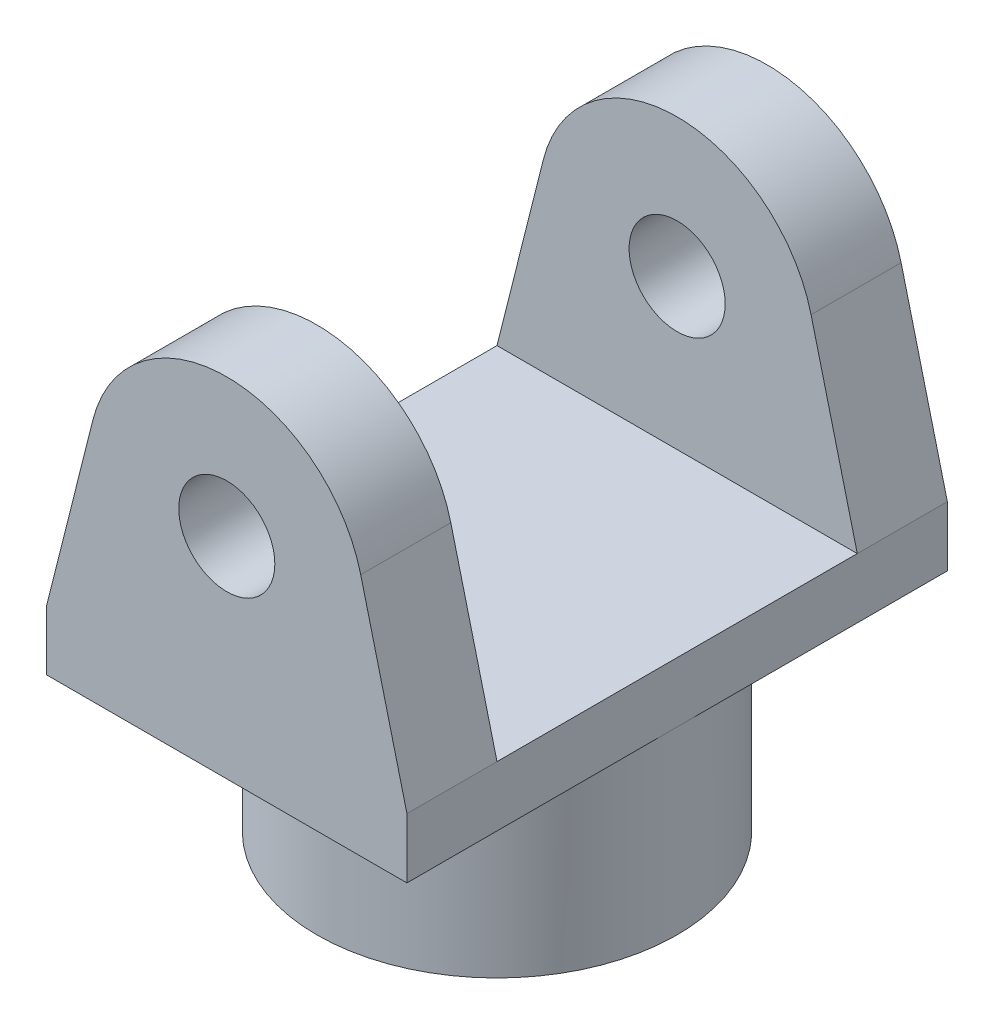
ISO-10303-21;
HEADER;
FILE_DESCRIPTION(('STEP AP214'),'2;1');
FILE_NAME('part.step','',(''),(''),'','','');
FILE_SCHEMA(('AUTOMOTIVE_DESIGN { 1 0 10303 214 1 1 1 1 }'));
ENDSEC;
DATA;
#1=APPLICATION_CONTEXT('core data for automotive mechanical design processes');
#2=APPLICATION_PROTOCOL_DEFINITION('international standard','automotive_design',2000,#1);
#3=PRODUCT_CONTEXT('',#1,'mechanical');
#4=PRODUCT('Part','Part','',(#3));
#5=PRODUCT_RELATED_PRODUCT_CATEGORY('part','',(#4));
#6=PRODUCT_DEFINITION_FORMATION('','',#4);
#7=PRODUCT_DEFINITION_CONTEXT('part definition',#1,'design');
#8=PRODUCT_DEFINITION('design','',#6,#7);
#9=PRODUCT_DEFINITION_SHAPE('','',#8);
#10=(LENGTH_UNIT() NAMED_UNIT(*) SI_UNIT(.MILLI.,.METRE.));
#11=(NAMED_UNIT(*) PLANE_ANGLE_UNIT() SI_UNIT($,.RADIAN.));
#12=(NAMED_UNIT(*) SI_UNIT($,.STERADIAN.) SOLID_ANGLE_UNIT());
#13=UNCERTAINTY_MEASURE_WITH_UNIT(LENGTH_MEASURE(1.E-05),#10,'distance_accuracy_value','');
#14=(GEOMETRIC_REPRESENTATION_CONTEXT(3) GLOBAL_UNCERTAINTY_ASSIGNED_CONTEXT((#13)) GLOBAL_UNIT_ASSIGNED_CONTEXT((#10,
#11,#12)) REPRESENTATION_CONTEXT('',''));
#15=CARTESIAN_POINT('',(0.,0.,0.));
#16=DIRECTION('',(0.,0.,1.));
#17=DIRECTION('',(1.,0.,0.));
#18=AXIS2_PLACEMENT_3D('',#15,#16,#17);
#19=CARTESIAN_POINT('',(0.,10.,0.));
#20=DIRECTION('',(0.,1.,0.));
#21=DIRECTION('',(0.,0.,1.));
#22=AXIS2_PLACEMENT_3D('',#19,#20,#21);
#23=PLANE('',#22);
#24=DIRECTION('',(0.,0.,-1.));
#25=VECTOR('',#24,1.);
#26=CARTESIAN_POINT('',(30.,10.,0.));
#27=LINE('',#26,#25);
#28=CARTESIAN_POINT('',(30.,10.,30.));
#29=VERTEX_POINT('',#28);
#30=CARTESIAN_POINT('',(30.,10.,-30.));
#31=VERTEX_POINT('',#30);
#32=EDGE_CURVE('E261',#29,#31,#27,.T.);
#33=ORIENTED_EDGE('',*,*,#32,.T.);
#34=DIRECTION('',(-1.,0.,0.));
#35=VECTOR('',#34,1.);
#36=CARTESIAN_POINT('',(0.,10.,-30.));
#37=LINE('',#36,#35);
#38=CARTESIAN_POINT('',(-30.,10.,-30.));
#39=VERTEX_POINT('',#38);
#40=EDGE_CURVE('E54',#31,#39,#37,.T.);
#41=ORIENTED_EDGE('',*,*,#40,.T.);
#42=DIRECTION('',(0.,0.,-1.));
#43=VECTOR('',#42,1.);
#44=CARTESIAN_POINT('',(-30.,10.,0.));
#45=LINE('',#44,#43);
#46=CARTESIAN_POINT('',(-30.,10.,30.));
#47=VERTEX_POINT('',#46);
#48=EDGE_CURVE('E260',#47,#39,#45,.T.);
#49=ORIENTED_EDGE('',*,*,#48,.F.);
#50=DIRECTION('',(-1.,0.,0.));
#51=VECTOR('',#50,1.);
#52=CARTESIAN_POINT('',(0.,10.,30.));
#53=LINE('',#52,#51);
#54=EDGE_CURVE('E202',#29,#47,#53,.T.);
#55=ORIENTED_EDGE('',*,*,#54,.F.);
#56=EDGE_LOOP('',(#33,#41,#49,#55));
#57=FACE_BOUND('',#56,.T.);
#58=ADVANCED_FACE('F37',(#57),#23,.T.);
#59=CARTESIAN_POINT('',(0.,0.,0.));
#60=DIRECTION('',(0.,1.,0.));
#61=DIRECTION('',(0.,0.,1.));
#62=AXIS2_PLACEMENT_3D('',#59,#60,#61);
#63=PLANE('',#62);
#64=DIRECTION('',(0.,0.,-1.));
#65=VECTOR('',#64,1.);
#66=CARTESIAN_POINT('',(30.,0.,0.));
#67=LINE('',#66,#65);
#68=CARTESIAN_POINT('',(30.,0.,0.));
#69=VERTEX_POINT('',#68);
#70=CARTESIAN_POINT('',(30.,0.,-45.));
#71=VERTEX_POINT('',#70);
#72=EDGE_CURVE('E248',#69,#71,#67,.T.);
#73=ORIENTED_EDGE('',*,*,#72,.F.);
#74=CARTESIAN_POINT('',(0.,0.,0.));
#75=DIRECTION('',(0.,1.,0.));
#76=DIRECTION('',(0.,0.,1.));
#77=AXIS2_PLACEMENT_3D('',#74,#75,#76);
#78=CIRCLE('',#77,30.);
#79=CARTESIAN_POINT('',(-30.,0.,0.));
#80=VERTEX_POINT('',#79);
#81=EDGE_CURVE('E47',#69,#80,#78,.T.);
#82=ORIENTED_EDGE('',*,*,#81,.T.);
#83=DIRECTION('',(0.,0.,-1.));
#84=VECTOR('',#83,1.);
#85=CARTESIAN_POINT('',(-30.,0.,0.));
#86=LINE('',#85,#84);
#87=CARTESIAN_POINT('',(-30.,0.,-45.));
#88=VERTEX_POINT('',#87);
#89=EDGE_CURVE('E271',#80,#88,#86,.T.);
#90=ORIENTED_EDGE('',*,*,#89,.T.);
#91=DIRECTION('',(-1.,0.,0.));
#92=VECTOR('',#91,1.);
#93=CARTESIAN_POINT('',(0.,0.,-45.));
#94=LINE('',#93,#92);
#95=EDGE_CURVE('E268',#71,#88,#94,.T.);
#96=ORIENTED_EDGE('',*,*,#95,.F.);
#97=EDGE_LOOP('',(#73,#82,#90,#96));
#98=FACE_BOUND('',#97,.T.);
#99=ADVANCED_FACE('F308',(#98),#63,.F.);
#100=CARTESIAN_POINT('',(30.,10.,0.));
#101=DIRECTION('',(-1.,0.,0.));
#102=DIRECTION('',(0.,0.,1.));
#103=AXIS2_PLACEMENT_3D('',#100,#101,#102);
#104=PLANE('',#103);
#105=CARTESIAN_POINT('',(30.,0.,45.));
#106=VERTEX_POINT('',#105);
#107=EDGE_CURVE('E265',#106,#69,#67,.T.);
#108=ORIENTED_EDGE('',*,*,#107,.T.);
#109=ORIENTED_EDGE('',*,*,#72,.T.);
#110=DIRECTION('',(0.,-1.,0.));
#111=VECTOR('',#110,1.);
#112=CARTESIAN_POINT('',(30.,10.,-45.));
#113=LINE('',#112,#111);
#114=CARTESIAN_POINT('',(30.,10.,-45.));
#115=VERTEX_POINT('',#114);
#116=EDGE_CURVE('E41',#115,#71,#113,.T.);
#117=ORIENTED_EDGE('',*,*,#116,.F.);
#118=DIRECTION('',(0.,0.,-1.));
#119=VECTOR('',#118,1.);
#120=CARTESIAN_POINT('',(30.,10.,-30.));
#121=LINE('',#120,#119);
#122=EDGE_CURVE('E62',#31,#115,#121,.T.);
#123=ORIENTED_EDGE('',*,*,#122,.F.);
#124=ORIENTED_EDGE('',*,*,#32,.F.);
#125=CARTESIAN_POINT('',(30.,10.,45.));
#126=VERTEX_POINT('',#125);
#127=EDGE_CURVE('E257',#126,#29,#27,.T.);
#128=ORIENTED_EDGE('',*,*,#127,.F.);
#129=DIRECTION('',(0.,-1.,0.));
#130=VECTOR('',#129,1.);
#131=CARTESIAN_POINT('',(30.,10.,45.));
#132=LINE('',#131,#130);
#133=EDGE_CURVE('E264',#126,#106,#132,.T.);
#134=ORIENTED_EDGE('',*,*,#133,.T.);
#135=EDGE_LOOP('',(#108,#109,#117,#123,#124,#128,#134));
#136=FACE_BOUND('',#135,.T.);
#137=ADVANCED_FACE('F39',(#136),#104,.F.);
#138=CARTESIAN_POINT('',(0.,10.,-45.));
#139=DIRECTION('',(0.,0.,1.));
#140=DIRECTION('',(1.,0.,0.));
#141=AXIS2_PLACEMENT_3D('',#138,#139,#140);
#142=PLANE('',#141);
#143=ORIENTED_EDGE('',*,*,#95,.T.);
#144=DIRECTION('',(0.,-1.,0.));
#145=VECTOR('',#144,1.);
#146=CARTESIAN_POINT('',(-30.,10.,-45.));
#147=LINE('',#146,#145);
#148=CARTESIAN_POINT('',(-30.,10.,-45.));
#149=VERTEX_POINT('',#148);
#150=EDGE_CURVE('E280',#149,#88,#147,.T.);
#151=ORIENTED_EDGE('',*,*,#150,.F.);
#152=DIRECTION('',(0.243792806743324,0.969827338952771,0.));
#153=VECTOR('',#152,1.);
#154=CARTESIAN_POINT('',(-30.5813213116034,7.68745719678904,-45.));
#155=LINE('',#154,#153);
#156=CARTESIAN_POINT('',(-22.3060287959137,40.6072345550965,-45.));
#157=VERTEX_POINT('',#156);
#158=EDGE_CURVE('E182',#149,#157,#155,.T.);
#159=ORIENTED_EDGE('',*,*,#158,.T.);
#160=CARTESIAN_POINT('',(0.,35.,-45.));
#161=DIRECTION('',(0.,0.,1.));
#162=DIRECTION('',(1.,0.,0.));
#163=AXIS2_PLACEMENT_3D('',#160,#161,#162);
#164=CIRCLE('',#163,23.);
#165=CARTESIAN_POINT('',(22.3060287959137,40.6072345550965,-45.));
#166=VERTEX_POINT('',#165);
#167=EDGE_CURVE('E162',#166,#157,#164,.T.);
#168=ORIENTED_EDGE('',*,*,#167,.F.);
#169=DIRECTION('',(-0.243792806743324,0.969827338952771,0.));
#170=VECTOR('',#169,1.);
#171=CARTESIAN_POINT('',(30.5813213116034,7.68745719678904,-45.));
#172=LINE('',#171,#170);
#173=EDGE_CURVE('E179',#115,#166,#172,.T.);
#174=ORIENTED_EDGE('',*,*,#173,.F.);
#175=ORIENTED_EDGE('',*,*,#116,.T.);
#176=EDGE_LOOP('',(#143,#151,#159,#168,#174,#175));
#177=FACE_BOUND('',#176,.T.);
#178=CARTESIAN_POINT('',(0.,35.,-45.));
#179=DIRECTION('',(0.,0.,1.));
#180=DIRECTION('',(1.,0.,0.));
#181=AXIS2_PLACEMENT_3D('',#178,#179,#180);
#182=CIRCLE('',#181,8.);
#183=CARTESIAN_POINT('',(7.99999999999999,35.,-45.));
#184=VERTEX_POINT('',#183);
#185=EDGE_CURVE('E176',#184,#184,#182,.T.);
#186=ORIENTED_EDGE('',*,*,#185,.T.);
#187=EDGE_LOOP('',(#186));
#188=FACE_BOUND('',#187,.T.);
#189=ADVANCED_FACE('F287',(#177,#188),#142,.F.);
#190=CARTESIAN_POINT('',(-30.,10.,0.));
#191=DIRECTION('',(-1.,0.,0.));
#192=DIRECTION('',(0.,0.,1.));
#193=AXIS2_PLACEMENT_3D('',#190,#191,#192);
#194=PLANE('',#193);
#195=CARTESIAN_POINT('',(-30.,0.,45.));
#196=VERTEX_POINT('',#195);
#197=EDGE_CURVE('E272',#196,#80,#86,.T.);
#198=ORIENTED_EDGE('',*,*,#197,.F.);
#199=DIRECTION('',(0.,-1.,0.));
#200=VECTOR('',#199,1.);
#201=CARTESIAN_POINT('',(-30.,10.,45.));
#202=LINE('',#201,#200);
#203=CARTESIAN_POINT('',(-30.,10.,45.));
#204=VERTEX_POINT('',#203);
#205=EDGE_CURVE('E279',#204,#196,#202,.T.);
#206=ORIENTED_EDGE('',*,*,#205,.F.);
#207=EDGE_CURVE('E262',#204,#47,#45,.T.);
#208=ORIENTED_EDGE('',*,*,#207,.T.);
#209=ORIENTED_EDGE('',*,*,#48,.T.);
#210=DIRECTION('',(0.,0.,-1.));
#211=VECTOR('',#210,1.);
#212=CARTESIAN_POINT('',(-30.,10.,-30.));
#213=LINE('',#212,#211);
#214=EDGE_CURVE('E167',#39,#149,#213,.T.);
#215=ORIENTED_EDGE('',*,*,#214,.T.);
#216=ORIENTED_EDGE('',*,*,#150,.T.);
#217=ORIENTED_EDGE('',*,*,#89,.F.);
#218=EDGE_LOOP('',(#198,#206,#208,#209,#215,#216,#217));
#219=FACE_BOUND('',#218,.T.);
#220=ADVANCED_FACE('F326',(#219),#194,.T.);
#221=CARTESIAN_POINT('',(0.,10.,45.));
#222=DIRECTION('',(0.,0.,1.));
#223=DIRECTION('',(1.,0.,0.));
#224=AXIS2_PLACEMENT_3D('',#221,#222,#223);
#225=PLANE('',#224);
#226=DIRECTION('',(-1.,0.,0.));
#227=VECTOR('',#226,1.);
#228=CARTESIAN_POINT('',(0.,0.,45.));
#229=LINE('',#228,#227);
#230=EDGE_CURVE('E275',#106,#196,#229,.T.);
#231=ORIENTED_EDGE('',*,*,#230,.F.);
#232=ORIENTED_EDGE('',*,*,#133,.F.);
#233=DIRECTION('',(-0.243792806743324,0.969827338952771,0.));
#234=VECTOR('',#233,1.);
#235=CARTESIAN_POINT('',(30.5813213116034,7.68745719678904,45.));
#236=LINE('',#235,#234);
#237=CARTESIAN_POINT('',(22.3060287959137,40.6072345550965,45.));
#238=VERTEX_POINT('',#237);
#239=EDGE_CURVE('E208',#126,#238,#236,.T.);
#240=ORIENTED_EDGE('',*,*,#239,.T.);
#241=CARTESIAN_POINT('',(0.,35.,45.));
#242=DIRECTION('',(0.,0.,1.));
#243=DIRECTION('',(1.,0.,0.));
#244=AXIS2_PLACEMENT_3D('',#241,#242,#243);
#245=CIRCLE('',#244,23.);
#246=CARTESIAN_POINT('',(-22.3060287959137,40.6072345550965,45.));
#247=VERTEX_POINT('',#246);
#248=EDGE_CURVE('E211',#238,#247,#245,.T.);
#249=ORIENTED_EDGE('',*,*,#248,.T.);
#250=DIRECTION('',(0.243792806743324,0.969827338952771,0.));
#251=VECTOR('',#250,1.);
#252=CARTESIAN_POINT('',(-30.5813213116034,7.68745719678904,45.));
#253=LINE('',#252,#251);
#254=EDGE_CURVE('E194',#204,#247,#253,.T.);
#255=ORIENTED_EDGE('',*,*,#254,.F.);
#256=ORIENTED_EDGE('',*,*,#205,.T.);
#257=EDGE_LOOP('',(#231,#232,#240,#249,#255,#256));
#258=FACE_BOUND('',#257,.T.);
#259=CARTESIAN_POINT('',(0.,35.,45.));
#260=DIRECTION('',(0.,0.,1.));
#261=DIRECTION('',(1.,0.,0.));
#262=AXIS2_PLACEMENT_3D('',#259,#260,#261);
#263=CIRCLE('',#262,8.);
#264=CARTESIAN_POINT('',(7.99999999999999,35.,45.));
#265=VERTEX_POINT('',#264);
#266=EDGE_CURVE('E186',#265,#265,#263,.T.);
#267=ORIENTED_EDGE('',*,*,#266,.F.);
#268=EDGE_LOOP('',(#267));
#269=FACE_BOUND('',#268,.T.);
#270=ADVANCED_FACE('F322',(#258,#269),#225,.T.);
#271=ORIENTED_EDGE('',*,*,#197,.T.);
#272=EDGE_CURVE('E11',#80,#69,#78,.T.);
#273=ORIENTED_EDGE('',*,*,#272,.T.);
#274=ORIENTED_EDGE('',*,*,#107,.F.);
#275=ORIENTED_EDGE('',*,*,#230,.T.);
#276=EDGE_LOOP('',(#271,#273,#274,#275));
#277=FACE_BOUND('',#276,.T.);
#278=ADVANCED_FACE('F315',(#277),#63,.F.);
#279=CARTESIAN_POINT('',(0.,-30.,0.));
#280=DIRECTION('',(0.,1.,0.));
#281=DIRECTION('',(0.,0.,1.));
#282=AXIS2_PLACEMENT_3D('',#279,#280,#281);
#283=CYLINDRICAL_SURFACE('',#282,15.);
#284=CARTESIAN_POINT('',(0.,0.,0.));
#285=DIRECTION('',(0.,1.,0.));
#286=DIRECTION('',(0.,0.,1.));
#287=AXIS2_PLACEMENT_3D('',#284,#285,#286);
#288=CIRCLE('',#287,15.);
#289=CARTESIAN_POINT('',(-5.,0.,-14.142135623731));
#290=VERTEX_POINT('',#289);
#291=CARTESIAN_POINT('',(5.,0.,-14.142135623731));
#292=VERTEX_POINT('',#291);
#293=EDGE_CURVE('E218',#290,#292,#288,.T.);
#294=ORIENTED_EDGE('',*,*,#293,.T.);
#295=DIRECTION('',(0.,1.,0.));
#296=VECTOR('',#295,1.);
#297=CARTESIAN_POINT('',(5.,-30.,-14.142135623731));
#298=LINE('',#297,#296);
#299=CARTESIAN_POINT('',(5.,-30.,-14.142135623731));
#300=VERTEX_POINT('',#299);
#301=EDGE_CURVE('E245',#300,#292,#298,.T.);
#302=ORIENTED_EDGE('',*,*,#301,.F.);
#303=CARTESIAN_POINT('',(0.,-30.,0.));
#304=DIRECTION('',(0.,1.,0.));
#305=DIRECTION('',(0.,0.,1.));
#306=AXIS2_PLACEMENT_3D('',#303,#304,#305);
#307=CIRCLE('',#306,15.);
#308=CARTESIAN_POINT('',(-5.,-30.,-14.142135623731));
#309=VERTEX_POINT('',#308);
#310=EDGE_CURVE('E220',#309,#300,#307,.T.);
#311=ORIENTED_EDGE('',*,*,#310,.F.);
#312=DIRECTION('',(0.,1.,0.));
#313=VECTOR('',#312,1.);
#314=CARTESIAN_POINT('',(-5.,-30.,-14.142135623731));
#315=LINE('',#314,#313);
#316=EDGE_CURVE('E234',#309,#290,#315,.T.);
#317=ORIENTED_EDGE('',*,*,#316,.T.);
#318=EDGE_LOOP('',(#294,#302,#311,#317));
#319=FACE_BOUND('',#318,.T.);
#320=ADVANCED_FACE('F318',(#319),#283,.F.);
#321=CARTESIAN_POINT('',(5.,-30.,0.));
#322=DIRECTION('',(1.,0.,0.));
#323=DIRECTION('',(0.,0.,-1.));
#324=AXIS2_PLACEMENT_3D('',#321,#322,#323);
#325=PLANE('',#324);
#326=DIRECTION('',(0.,0.,-1.));
#327=VECTOR('',#326,1.);
#328=CARTESIAN_POINT('',(5.,0.,0.));
#329=LINE('',#328,#327);
#330=CARTESIAN_POINT('',(5.,0.,-20.142135623731));
#331=VERTEX_POINT('',#330);
#332=EDGE_CURVE('E241',#292,#331,#329,.T.);
#333=ORIENTED_EDGE('',*,*,#332,.T.);
#334=DIRECTION('',(0.,1.,0.));
#335=VECTOR('',#334,1.);
#336=CARTESIAN_POINT('',(5.,-30.,-20.142135623731));
#337=LINE('',#336,#335);
#338=CARTESIAN_POINT('',(5.,-30.,-20.142135623731));
#339=VERTEX_POINT('',#338);
#340=EDGE_CURVE('E249',#339,#331,#337,.T.);
#341=ORIENTED_EDGE('',*,*,#340,.F.);
#342=DIRECTION('',(0.,0.,-1.));
#343=VECTOR('',#342,1.);
#344=CARTESIAN_POINT('',(5.,-30.,0.));
#345=LINE('',#344,#343);
#346=EDGE_CURVE('E229',#300,#339,#345,.T.);
#347=ORIENTED_EDGE('',*,*,#346,.F.);
#348=ORIENTED_EDGE('',*,*,#301,.T.);
#349=EDGE_LOOP('',(#333,#341,#347,#348));
#350=FACE_BOUND('',#349,.T.);
#351=ADVANCED_FACE('F358',(#350),#325,.F.);
#352=CARTESIAN_POINT('',(0.,-30.,-20.142135623731));
#353=DIRECTION('',(0.,0.,1.));
#354=DIRECTION('',(1.,0.,0.));
#355=AXIS2_PLACEMENT_3D('',#352,#353,#354);
#356=PLANE('',#355);
#357=DIRECTION('',(1.,0.,0.));
#358=VECTOR('',#357,1.);
#359=CARTESIAN_POINT('',(0.,0.,-20.142135623731));
#360=LINE('',#359,#358);
#361=CARTESIAN_POINT('',(-5.,0.,-20.142135623731));
#362=VERTEX_POINT('',#361);
#363=EDGE_CURVE('E239',#362,#331,#360,.T.);
#364=ORIENTED_EDGE('',*,*,#363,.F.);
#365=DIRECTION('',(0.,1.,0.));
#366=VECTOR('',#365,1.);
#367=CARTESIAN_POINT('',(-5.,-30.,-20.142135623731));
#368=LINE('',#367,#366);
#369=CARTESIAN_POINT('',(-5.,-30.,-20.142135623731));
#370=VERTEX_POINT('',#369);
#371=EDGE_CURVE('E252',#370,#362,#368,.T.);
#372=ORIENTED_EDGE('',*,*,#371,.F.);
#373=DIRECTION('',(1.,0.,0.));
#374=VECTOR('',#373,1.);
#375=CARTESIAN_POINT('',(0.,-30.,-20.142135623731));
#376=LINE('',#375,#374);
#377=EDGE_CURVE('E226',#370,#339,#376,.T.);
#378=ORIENTED_EDGE('',*,*,#377,.T.);
#379=ORIENTED_EDGE('',*,*,#340,.T.);
#380=EDGE_LOOP('',(#364,#372,#378,#379));
#381=FACE_BOUND('',#380,.T.);
#382=ADVANCED_FACE('F368',(#381),#356,.T.);
#383=CARTESIAN_POINT('',(-5.,-30.,0.));
#384=DIRECTION('',(1.,0.,0.));
#385=DIRECTION('',(0.,0.,-1.));
#386=AXIS2_PLACEMENT_3D('',#383,#384,#385);
#387=PLANE('',#386);
#388=DIRECTION('',(0.,0.,-1.));
#389=VECTOR('',#388,1.);
#390=CARTESIAN_POINT('',(-5.,0.,0.));
#391=LINE('',#390,#389);
#392=EDGE_CURVE('E237',#290,#362,#391,.T.);
#393=ORIENTED_EDGE('',*,*,#392,.F.);
#394=ORIENTED_EDGE('',*,*,#316,.F.);
#395=DIRECTION('',(0.,0.,-1.));
#396=VECTOR('',#395,1.);
#397=CARTESIAN_POINT('',(-5.,-30.,0.));
#398=LINE('',#397,#396);
#399=EDGE_CURVE('E223',#309,#370,#398,.T.);
#400=ORIENTED_EDGE('',*,*,#399,.T.);
#401=ORIENTED_EDGE('',*,*,#371,.T.);
#402=EDGE_LOOP('',(#393,#394,#400,#401));
#403=FACE_BOUND('',#402,.T.);
#404=ADVANCED_FACE('F378',(#403),#387,.T.);
#405=CARTESIAN_POINT('',(0.,-30.,0.));
#406=DIRECTION('',(0.,1.,0.));
#407=DIRECTION('',(0.,0.,1.));
#408=AXIS2_PLACEMENT_3D('',#405,#406,#407);
#409=CYLINDRICAL_SURFACE('',#408,30.);
#410=CARTESIAN_POINT('',(0.,-30.,0.));
#411=DIRECTION('',(0.,1.,0.));
#412=DIRECTION('',(0.,0.,1.));
#413=AXIS2_PLACEMENT_3D('',#410,#411,#412);
#414=CIRCLE('',#413,30.);
#415=CARTESIAN_POINT('',(0.,-30.,30.));
#416=VERTEX_POINT('',#415);
#417=EDGE_CURVE('E231',#416,#416,#414,.T.);
#418=ORIENTED_EDGE('',*,*,#417,.T.);
#419=EDGE_LOOP('',(#418));
#420=FACE_BOUND('',#419,.T.);
#421=ORIENTED_EDGE('',*,*,#81,.F.);
#422=ORIENTED_EDGE('',*,*,#272,.F.);
#423=EDGE_LOOP('',(#421,#422));
#424=FACE_BOUND('',#423,.T.);
#425=ADVANCED_FACE('F388',(#420,#424),#409,.T.);
#426=CARTESIAN_POINT('',(0.,-30.,0.));
#427=DIRECTION('',(0.,1.,0.));
#428=DIRECTION('',(0.,0.,1.));
#429=AXIS2_PLACEMENT_3D('',#426,#427,#428);
#430=PLANE('',#429);
#431=ORIENTED_EDGE('',*,*,#310,.T.);
#432=ORIENTED_EDGE('',*,*,#346,.T.);
#433=ORIENTED_EDGE('',*,*,#377,.F.);
#434=ORIENTED_EDGE('',*,*,#399,.F.);
#435=EDGE_LOOP('',(#431,#432,#433,#434));
#436=FACE_BOUND('',#435,.T.);
#437=ORIENTED_EDGE('',*,*,#417,.F.);
#438=EDGE_LOOP('',(#437));
#439=FACE_BOUND('',#438,.T.);
#440=ADVANCED_FACE('F397',(#436,#439),#430,.F.);
#441=ORIENTED_EDGE('',*,*,#293,.F.);
#442=ORIENTED_EDGE('',*,*,#392,.T.);
#443=ORIENTED_EDGE('',*,*,#363,.T.);
#444=ORIENTED_EDGE('',*,*,#332,.F.);
#445=EDGE_LOOP('',(#441,#442,#443,#444));
#446=FACE_BOUND('',#445,.T.);
#447=ADVANCED_FACE('F316',(#446),#63,.F.);
#448=CARTESIAN_POINT('',(30.5813213116034,7.68745719678904,30.));
#449=DIRECTION('',(0.969827338952771,0.243792806743324,0.));
#450=DIRECTION('',(-0.243792806743324,0.969827338952771,0.));
#451=AXIS2_PLACEMENT_3D('',#448,#449,#450);
#452=PLANE('',#451);
#453=ORIENTED_EDGE('',*,*,#239,.F.);
#454=ORIENTED_EDGE('',*,*,#127,.T.);
#455=DIRECTION('',(-0.243792806743324,0.969827338952771,0.));
#456=VECTOR('',#455,1.);
#457=CARTESIAN_POINT('',(30.5813213116034,7.68745719678904,30.));
#458=LINE('',#457,#456);
#459=CARTESIAN_POINT('',(22.3060287959137,40.6072345550965,30.));
#460=VERTEX_POINT('',#459);
#461=EDGE_CURVE('E193',#29,#460,#458,.T.);
#462=ORIENTED_EDGE('',*,*,#461,.T.);
#463=DIRECTION('',(0.,0.,1.));
#464=VECTOR('',#463,1.);
#465=CARTESIAN_POINT('',(22.3060287959137,40.6072345550965,30.));
#466=LINE('',#465,#464);
#467=EDGE_CURVE('E205',#460,#238,#466,.T.);
#468=ORIENTED_EDGE('',*,*,#467,.T.);
#469=EDGE_LOOP('',(#453,#454,#462,#468));
#470=FACE_BOUND('',#469,.T.);
#471=ADVANCED_FACE('F416',(#470),#452,.T.);
#472=CARTESIAN_POINT('',(-30.5813213116034,7.68745719678904,30.));
#473=DIRECTION('',(0.969827338952771,-0.243792806743324,0.));
#474=DIRECTION('',(0.243792806743324,0.969827338952771,0.));
#475=AXIS2_PLACEMENT_3D('',#472,#473,#474);
#476=PLANE('',#475);
#477=ORIENTED_EDGE('',*,*,#254,.T.);
#478=DIRECTION('',(0.,0.,1.));
#479=VECTOR('',#478,1.);
#480=CARTESIAN_POINT('',(-22.3060287959137,40.6072345550965,30.));
#481=LINE('',#480,#479);
#482=CARTESIAN_POINT('',(-22.3060287959137,40.6072345550965,30.));
#483=VERTEX_POINT('',#482);
#484=EDGE_CURVE('E216',#483,#247,#481,.T.);
#485=ORIENTED_EDGE('',*,*,#484,.F.);
#486=DIRECTION('',(0.243792806743324,0.969827338952771,0.));
#487=VECTOR('',#486,1.);
#488=CARTESIAN_POINT('',(-30.5813213116034,7.68745719678904,30.));
#489=LINE('',#488,#487);
#490=EDGE_CURVE('E200',#47,#483,#489,.T.);
#491=ORIENTED_EDGE('',*,*,#490,.F.);
#492=ORIENTED_EDGE('',*,*,#207,.F.);
#493=EDGE_LOOP('',(#477,#485,#491,#492));
#494=FACE_BOUND('',#493,.T.);
#495=ADVANCED_FACE('F432',(#494),#476,.F.);
#496=CARTESIAN_POINT('',(0.,35.,30.));
#497=DIRECTION('',(0.,0.,1.));
#498=DIRECTION('',(1.,0.,0.));
#499=AXIS2_PLACEMENT_3D('',#496,#497,#498);
#500=CYLINDRICAL_SURFACE('',#499,8.);
#501=CARTESIAN_POINT('',(0.,35.,30.));
#502=DIRECTION('',(0.,0.,1.));
#503=DIRECTION('',(1.,0.,0.));
#504=AXIS2_PLACEMENT_3D('',#501,#502,#503);
#505=CIRCLE('',#504,8.);
#506=CARTESIAN_POINT('',(7.99999999999999,35.,30.));
#507=VERTEX_POINT('',#506);
#508=EDGE_CURVE('E190',#507,#507,#505,.T.);
#509=ORIENTED_EDGE('',*,*,#508,.F.);
#510=EDGE_LOOP('',(#509));
#511=FACE_BOUND('',#510,.T.);
#512=ORIENTED_EDGE('',*,*,#266,.T.);
#513=EDGE_LOOP('',(#512));
#514=FACE_BOUND('',#513,.T.);
#515=ADVANCED_FACE('F442',(#511,#514),#500,.F.);
#516=CARTESIAN_POINT('',(0.,35.,30.));
#517=DIRECTION('',(0.,0.,1.));
#518=DIRECTION('',(1.,0.,0.));
#519=AXIS2_PLACEMENT_3D('',#516,#517,#518);
#520=CYLINDRICAL_SURFACE('',#519,23.);
#521=ORIENTED_EDGE('',*,*,#248,.F.);
#522=ORIENTED_EDGE('',*,*,#467,.F.);
#523=CARTESIAN_POINT('',(0.,35.,30.));
#524=DIRECTION('',(0.,0.,1.));
#525=DIRECTION('',(1.,0.,0.));
#526=AXIS2_PLACEMENT_3D('',#523,#524,#525);
#527=CIRCLE('',#526,23.);
#528=EDGE_CURVE('E197',#460,#483,#527,.T.);
#529=ORIENTED_EDGE('',*,*,#528,.T.);
#530=ORIENTED_EDGE('',*,*,#484,.T.);
#531=EDGE_LOOP('',(#521,#522,#529,#530));
#532=FACE_BOUND('',#531,.T.);
#533=ADVANCED_FACE('F452',(#532),#520,.T.);
#534=CARTESIAN_POINT('',(0.,0.,30.));
#535=DIRECTION('',(0.,0.,1.));
#536=DIRECTION('',(1.,0.,0.));
#537=AXIS2_PLACEMENT_3D('',#534,#535,#536);
#538=PLANE('',#537);
#539=ORIENTED_EDGE('',*,*,#508,.T.);
#540=EDGE_LOOP('',(#539));
#541=FACE_BOUND('',#540,.T.);
#542=ORIENTED_EDGE('',*,*,#461,.F.);
#543=ORIENTED_EDGE('',*,*,#54,.T.);
#544=ORIENTED_EDGE('',*,*,#490,.T.);
#545=ORIENTED_EDGE('',*,*,#528,.F.);
#546=EDGE_LOOP('',(#542,#543,#544,#545));
#547=FACE_BOUND('',#546,.T.);
#548=ADVANCED_FACE('F462',(#541,#547),#538,.F.);
#549=CARTESIAN_POINT('',(30.5813213116034,7.68745719678904,-30.));
#550=DIRECTION('',(-0.969827338952771,-0.243792806743324,0.));
#551=DIRECTION('',(0.243792806743324,-0.969827338952771,0.));
#552=AXIS2_PLACEMENT_3D('',#549,#550,#551);
#553=PLANE('',#552);
#554=ORIENTED_EDGE('',*,*,#173,.T.);
#555=DIRECTION('',(0.,0.,-1.));
#556=VECTOR('',#555,1.);
#557=CARTESIAN_POINT('',(22.3060287959137,40.6072345550965,-30.));
#558=LINE('',#557,#556);
#559=CARTESIAN_POINT('',(22.3060287959137,40.6072345550965,-30.));
#560=VERTEX_POINT('',#559);
#561=EDGE_CURVE('E166',#560,#166,#558,.T.);
#562=ORIENTED_EDGE('',*,*,#561,.F.);
#563=DIRECTION('',(-0.243792806743324,0.969827338952771,0.));
#564=VECTOR('',#563,1.);
#565=CARTESIAN_POINT('',(30.5813213116034,7.68745719678904,-30.));
#566=LINE('',#565,#564);
#567=EDGE_CURVE('E154',#31,#560,#566,.T.);
#568=ORIENTED_EDGE('',*,*,#567,.F.);
#569=ORIENTED_EDGE('',*,*,#122,.T.);
#570=EDGE_LOOP('',(#554,#562,#568,#569));
#571=FACE_BOUND('',#570,.T.);
#572=ADVANCED_FACE('F292',(#571),#553,.F.);
#573=CARTESIAN_POINT('',(0.,35.,-30.));
#574=DIRECTION('',(0.,0.,-1.));
#575=DIRECTION('',(-1.,0.,0.));
#576=AXIS2_PLACEMENT_3D('',#573,#574,#575);
#577=CYLINDRICAL_SURFACE('',#576,23.);
#578=ORIENTED_EDGE('',*,*,#167,.T.);
#579=DIRECTION('',(0.,0.,-1.));
#580=VECTOR('',#579,1.);
#581=CARTESIAN_POINT('',(-22.3060287959137,40.6072345550965,-30.));
#582=LINE('',#581,#580);
#583=CARTESIAN_POINT('',(-22.3060287959137,40.6072345550965,-30.));
#584=VERTEX_POINT('',#583);
#585=EDGE_CURVE('E160',#584,#157,#582,.T.);
#586=ORIENTED_EDGE('',*,*,#585,.F.);
#587=CARTESIAN_POINT('',(0.,35.,-30.));
#588=DIRECTION('',(0.,0.,1.));
#589=DIRECTION('',(1.,0.,0.));
#590=AXIS2_PLACEMENT_3D('',#587,#588,#589);
#591=CIRCLE('',#590,23.);
#592=EDGE_CURVE('E148',#560,#584,#591,.T.);
#593=ORIENTED_EDGE('',*,*,#592,.F.);
#594=ORIENTED_EDGE('',*,*,#561,.T.);
#595=EDGE_LOOP('',(#578,#586,#593,#594));
#596=FACE_BOUND('',#595,.T.);
#597=ADVANCED_FACE('F161',(#596),#577,.T.);
#598=CARTESIAN_POINT('',(-30.5813213116034,7.68745719678904,-30.));
#599=DIRECTION('',(-0.969827338952771,0.243792806743324,0.));
#600=DIRECTION('',(-0.243792806743324,-0.969827338952771,0.));
#601=AXIS2_PLACEMENT_3D('',#598,#599,#600);
#602=PLANE('',#601);
#603=ORIENTED_EDGE('',*,*,#158,.F.);
#604=ORIENTED_EDGE('',*,*,#214,.F.);
#605=DIRECTION('',(0.243792806743324,0.969827338952771,0.));
#606=VECTOR('',#605,1.);
#607=CARTESIAN_POINT('',(-30.5813213116034,7.68745719678904,-30.));
#608=LINE('',#607,#606);
#609=EDGE_CURVE('E152',#39,#584,#608,.T.);
#610=ORIENTED_EDGE('',*,*,#609,.T.);
#611=ORIENTED_EDGE('',*,*,#585,.T.);
#612=EDGE_LOOP('',(#603,#604,#610,#611));
#613=FACE_BOUND('',#612,.T.);
#614=ADVANCED_FACE('F170',(#613),#602,.T.);
#615=CARTESIAN_POINT('',(0.,35.,-30.));
#616=DIRECTION('',(0.,0.,-1.));
#617=DIRECTION('',(-1.,0.,0.));
#618=AXIS2_PLACEMENT_3D('',#615,#616,#617);
#619=CYLINDRICAL_SURFACE('',#618,8.);
#620=CARTESIAN_POINT('',(0.,35.,-30.));
#621=DIRECTION('',(0.,0.,1.));
#622=DIRECTION('',(1.,0.,0.));
#623=AXIS2_PLACEMENT_3D('',#620,#621,#622);
#624=CIRCLE('',#623,8.);
#625=CARTESIAN_POINT('',(7.99999999999999,35.,-30.));
#626=VERTEX_POINT('',#625);
#627=EDGE_CURVE('E185',#626,#626,#624,.T.);
#628=ORIENTED_EDGE('',*,*,#627,.T.);
#629=EDGE_LOOP('',(#628));
#630=FACE_BOUND('',#629,.T.);
#631=ORIENTED_EDGE('',*,*,#185,.F.);
#632=EDGE_LOOP('',(#631));
#633=FACE_BOUND('',#632,.T.);
#634=ADVANCED_FACE('F297',(#630,#633),#619,.F.);
#635=CARTESIAN_POINT('',(0.,0.,-30.));
#636=DIRECTION('',(0.,0.,-1.));
#637=DIRECTION('',(1.,0.,0.));
#638=AXIS2_PLACEMENT_3D('',#635,#636,#637);
#639=PLANE('',#638);
#640=ORIENTED_EDGE('',*,*,#627,.F.);
#641=EDGE_LOOP('',(#640));
#642=FACE_BOUND('',#641,.T.);
#643=ORIENTED_EDGE('',*,*,#567,.T.);
#644=ORIENTED_EDGE('',*,*,#592,.T.);
#645=ORIENTED_EDGE('',*,*,#609,.F.);
#646=ORIENTED_EDGE('',*,*,#40,.F.);
#647=EDGE_LOOP('',(#643,#644,#645,#646));
#648=FACE_BOUND('',#647,.T.);
#649=ADVANCED_FACE('F150',(#642,#648),#639,.F.);
#650=CLOSED_SHELL('',(#58,#99,#137,#189,#220,#270,#278,#320,#351,#382,#404,#425,#440,#447,#471,
#495,#515,#533,#548,#572,#597,#614,#634,#649));
#651=MANIFOLD_SOLID_BREP('B2',#650);
#652=ADVANCED_BREP_SHAPE_REPRESENTATION('',(#18,#651),#14);
#653=SHAPE_DEFINITION_REPRESENTATION(#9,#652);
ENDSEC;
END-ISO-10303-21;
